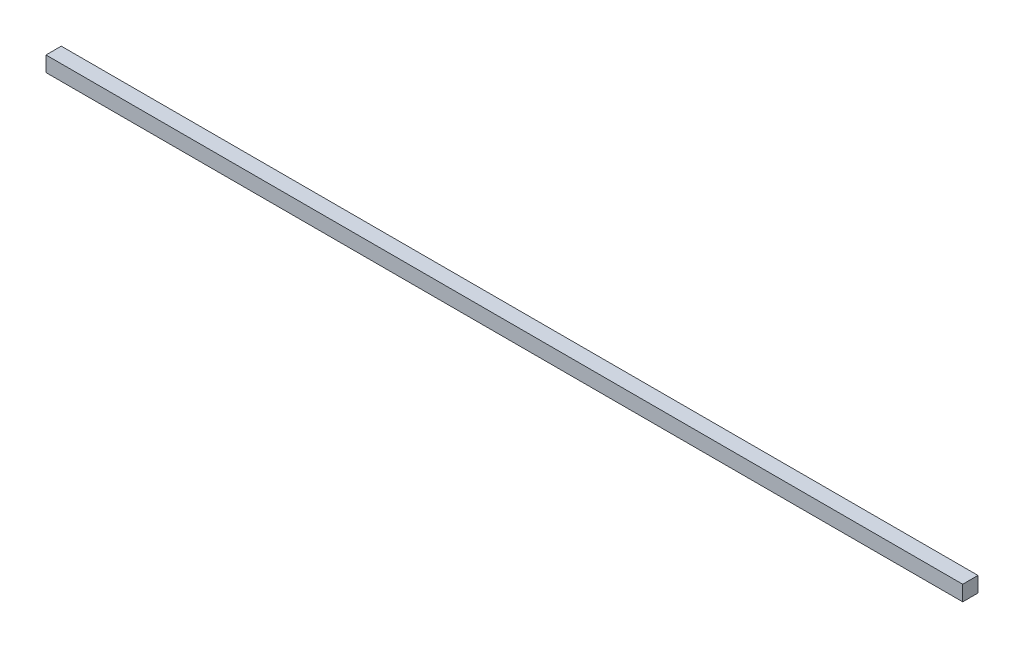
ISO-10303-21;
HEADER;
FILE_DESCRIPTION(('STEP AP214'),'2;1');
FILE_NAME('part.step','',(''),(''),'','','');
FILE_SCHEMA(('AUTOMOTIVE_DESIGN { 1 0 10303 214 1 1 1 1 }'));
ENDSEC;
DATA;
#1=APPLICATION_CONTEXT('core data for automotive mechanical design processes');
#2=APPLICATION_PROTOCOL_DEFINITION('international standard','automotive_design',2000,#1);
#3=PRODUCT_CONTEXT('',#1,'mechanical');
#4=PRODUCT('Part','Part','',(#3));
#5=PRODUCT_RELATED_PRODUCT_CATEGORY('part','',(#4));
#6=PRODUCT_DEFINITION_FORMATION('','',#4);
#7=PRODUCT_DEFINITION_CONTEXT('part definition',#1,'design');
#8=PRODUCT_DEFINITION('design','',#6,#7);
#9=PRODUCT_DEFINITION_SHAPE('','',#8);
#10=(LENGTH_UNIT() NAMED_UNIT(*) SI_UNIT(.MILLI.,.METRE.));
#11=(NAMED_UNIT(*) PLANE_ANGLE_UNIT() SI_UNIT($,.RADIAN.));
#12=(NAMED_UNIT(*) SI_UNIT($,.STERADIAN.) SOLID_ANGLE_UNIT());
#13=UNCERTAINTY_MEASURE_WITH_UNIT(LENGTH_MEASURE(1.E-05),#10,'distance_accuracy_value','');
#14=(GEOMETRIC_REPRESENTATION_CONTEXT(3) GLOBAL_UNCERTAINTY_ASSIGNED_CONTEXT((#13)) GLOBAL_UNIT_ASSIGNED_CONTEXT((#10,
#11,#12)) REPRESENTATION_CONTEXT('',''));
#15=CARTESIAN_POINT('',(0.,0.,0.));
#16=DIRECTION('',(0.,0.,1.));
#17=DIRECTION('',(1.,0.,0.));
#18=AXIS2_PLACEMENT_3D('',#15,#16,#17);
#19=CARTESIAN_POINT('',(600.,20.,-220.));
#20=DIRECTION('',(-1.,0.,0.));
#21=DIRECTION('',(0.,0.,1.));
#22=AXIS2_PLACEMENT_3D('',#19,#20,#21);
#23=PLANE('',#22);
#24=DIRECTION('',(0.,0.,-1.));
#25=VECTOR('',#24,1.);
#26=CARTESIAN_POINT('',(600.,0.,-220.));
#27=LINE('',#26,#25);
#28=CARTESIAN_POINT('',(600.,0.,-200.));
#29=VERTEX_POINT('',#28);
#30=CARTESIAN_POINT('',(600.,0.,-220.));
#31=VERTEX_POINT('',#30);
#32=EDGE_CURVE('E106',#29,#31,#27,.T.);
#33=ORIENTED_EDGE('',*,*,#32,.T.);
#34=DIRECTION('',(0.,-1.,0.));
#35=VECTOR('',#34,1.);
#36=CARTESIAN_POINT('',(600.,20.,-220.));
#37=LINE('',#36,#35);
#38=CARTESIAN_POINT('',(600.,20.,-220.));
#39=VERTEX_POINT('',#38);
#40=EDGE_CURVE('E11',#39,#31,#37,.T.);
#41=ORIENTED_EDGE('',*,*,#40,.F.);
#42=DIRECTION('',(0.,0.,-1.));
#43=VECTOR('',#42,1.);
#44=CARTESIAN_POINT('',(600.,20.,-220.));
#45=LINE('',#44,#43);
#46=CARTESIAN_POINT('',(600.,20.,-200.));
#47=VERTEX_POINT('',#46);
#48=EDGE_CURVE('E90',#47,#39,#45,.T.);
#49=ORIENTED_EDGE('',*,*,#48,.F.);
#50=DIRECTION('',(0.,-1.,0.));
#51=VECTOR('',#50,1.);
#52=CARTESIAN_POINT('',(600.,20.,-200.));
#53=LINE('',#52,#51);
#54=EDGE_CURVE('E102',#47,#29,#53,.T.);
#55=ORIENTED_EDGE('',*,*,#54,.T.);
#56=EDGE_LOOP('',(#33,#41,#49,#55));
#57=FACE_BOUND('',#56,.T.);
#58=ADVANCED_FACE('F38',(#57),#23,.F.);
#59=CARTESIAN_POINT('',(-600.,20.,-220.));
#60=DIRECTION('',(0.,0.,1.));
#61=DIRECTION('',(1.,0.,0.));
#62=AXIS2_PLACEMENT_3D('',#59,#60,#61);
#63=PLANE('',#62);
#64=DIRECTION('',(-1.,0.,0.));
#65=VECTOR('',#64,1.);
#66=CARTESIAN_POINT('',(-600.,0.,-220.));
#67=LINE('',#66,#65);
#68=CARTESIAN_POINT('',(-600.,0.,-220.));
#69=VERTEX_POINT('',#68);
#70=EDGE_CURVE('E95',#31,#69,#67,.T.);
#71=ORIENTED_EDGE('',*,*,#70,.T.);
#72=DIRECTION('',(0.,-1.,0.));
#73=VECTOR('',#72,1.);
#74=CARTESIAN_POINT('',(-600.,20.,-220.));
#75=LINE('',#74,#73);
#76=CARTESIAN_POINT('',(-600.,20.,-220.));
#77=VERTEX_POINT('',#76);
#78=EDGE_CURVE('E47',#77,#69,#75,.T.);
#79=ORIENTED_EDGE('',*,*,#78,.F.);
#80=DIRECTION('',(-1.,0.,0.));
#81=VECTOR('',#80,1.);
#82=CARTESIAN_POINT('',(-600.,20.,-220.));
#83=LINE('',#82,#81);
#84=EDGE_CURVE('E85',#39,#77,#83,.T.);
#85=ORIENTED_EDGE('',*,*,#84,.F.);
#86=ORIENTED_EDGE('',*,*,#40,.T.);
#87=EDGE_LOOP('',(#71,#79,#85,#86));
#88=FACE_BOUND('',#87,.T.);
#89=ADVANCED_FACE('F94',(#88),#63,.F.);
#90=CARTESIAN_POINT('',(-600.,20.,-220.));
#91=DIRECTION('',(1.,0.,0.));
#92=DIRECTION('',(0.,0.,-1.));
#93=AXIS2_PLACEMENT_3D('',#90,#91,#92);
#94=PLANE('',#93);
#95=DIRECTION('',(0.,0.,1.));
#96=VECTOR('',#95,1.);
#97=CARTESIAN_POINT('',(-600.,0.,-220.));
#98=LINE('',#97,#96);
#99=CARTESIAN_POINT('',(-600.,0.,-200.));
#100=VERTEX_POINT('',#99);
#101=EDGE_CURVE('E72',#69,#100,#98,.T.);
#102=ORIENTED_EDGE('',*,*,#101,.T.);
#103=DIRECTION('',(0.,-1.,0.));
#104=VECTOR('',#103,1.);
#105=CARTESIAN_POINT('',(-600.,20.,-200.));
#106=LINE('',#105,#104);
#107=CARTESIAN_POINT('',(-600.,20.,-200.));
#108=VERTEX_POINT('',#107);
#109=EDGE_CURVE('E97',#108,#100,#106,.T.);
#110=ORIENTED_EDGE('',*,*,#109,.F.);
#111=DIRECTION('',(0.,0.,1.));
#112=VECTOR('',#111,1.);
#113=CARTESIAN_POINT('',(-600.,20.,-220.));
#114=LINE('',#113,#112);
#115=EDGE_CURVE('E88',#77,#108,#114,.T.);
#116=ORIENTED_EDGE('',*,*,#115,.F.);
#117=ORIENTED_EDGE('',*,*,#78,.T.);
#118=EDGE_LOOP('',(#102,#110,#116,#117));
#119=FACE_BOUND('',#118,.T.);
#120=ADVANCED_FACE('F98',(#119),#94,.F.);
#121=CARTESIAN_POINT('',(-600.,20.,-200.));
#122=DIRECTION('',(0.,0.,-1.));
#123=DIRECTION('',(-1.,0.,0.));
#124=AXIS2_PLACEMENT_3D('',#121,#122,#123);
#125=PLANE('',#124);
#126=DIRECTION('',(1.,0.,0.));
#127=VECTOR('',#126,1.);
#128=CARTESIAN_POINT('',(-600.,0.,-200.));
#129=LINE('',#128,#127);
#130=EDGE_CURVE('E78',#100,#29,#129,.T.);
#131=ORIENTED_EDGE('',*,*,#130,.T.);
#132=ORIENTED_EDGE('',*,*,#54,.F.);
#133=DIRECTION('',(1.,0.,0.));
#134=VECTOR('',#133,1.);
#135=CARTESIAN_POINT('',(-600.,20.,-200.));
#136=LINE('',#135,#134);
#137=EDGE_CURVE('E55',#108,#47,#136,.T.);
#138=ORIENTED_EDGE('',*,*,#137,.F.);
#139=ORIENTED_EDGE('',*,*,#109,.T.);
#140=EDGE_LOOP('',(#131,#132,#138,#139));
#141=FACE_BOUND('',#140,.T.);
#142=ADVANCED_FACE('F119',(#141),#125,.F.);
#143=CARTESIAN_POINT('',(0.,20.,0.));
#144=DIRECTION('',(0.,1.,0.));
#145=DIRECTION('',(0.,0.,1.));
#146=AXIS2_PLACEMENT_3D('',#143,#144,#145);
#147=PLANE('',#146);
#148=ORIENTED_EDGE('',*,*,#48,.T.);
#149=ORIENTED_EDGE('',*,*,#84,.T.);
#150=ORIENTED_EDGE('',*,*,#115,.T.);
#151=ORIENTED_EDGE('',*,*,#137,.T.);
#152=EDGE_LOOP('',(#148,#149,#150,#151));
#153=FACE_BOUND('',#152,.T.);
#154=ADVANCED_FACE('F86',(#153),#147,.T.);
#155=CARTESIAN_POINT('',(0.,0.,0.));
#156=DIRECTION('',(0.,1.,0.));
#157=DIRECTION('',(0.,0.,1.));
#158=AXIS2_PLACEMENT_3D('',#155,#156,#157);
#159=PLANE('',#158);
#160=ORIENTED_EDGE('',*,*,#32,.F.);
#161=ORIENTED_EDGE('',*,*,#130,.F.);
#162=ORIENTED_EDGE('',*,*,#101,.F.);
#163=ORIENTED_EDGE('',*,*,#70,.F.);
#164=EDGE_LOOP('',(#160,#161,#162,#163));
#165=FACE_BOUND('',#164,.T.);
#166=ADVANCED_FACE('F122',(#165),#159,.F.);
#167=CLOSED_SHELL('',(#58,#89,#120,#142,#154,#166));
#168=MANIFOLD_SOLID_BREP('B2',#167);
#169=ADVANCED_BREP_SHAPE_REPRESENTATION('',(#18,#168),#14);
#170=SHAPE_DEFINITION_REPRESENTATION(#9,#169);
ENDSEC;
END-ISO-10303-21;
